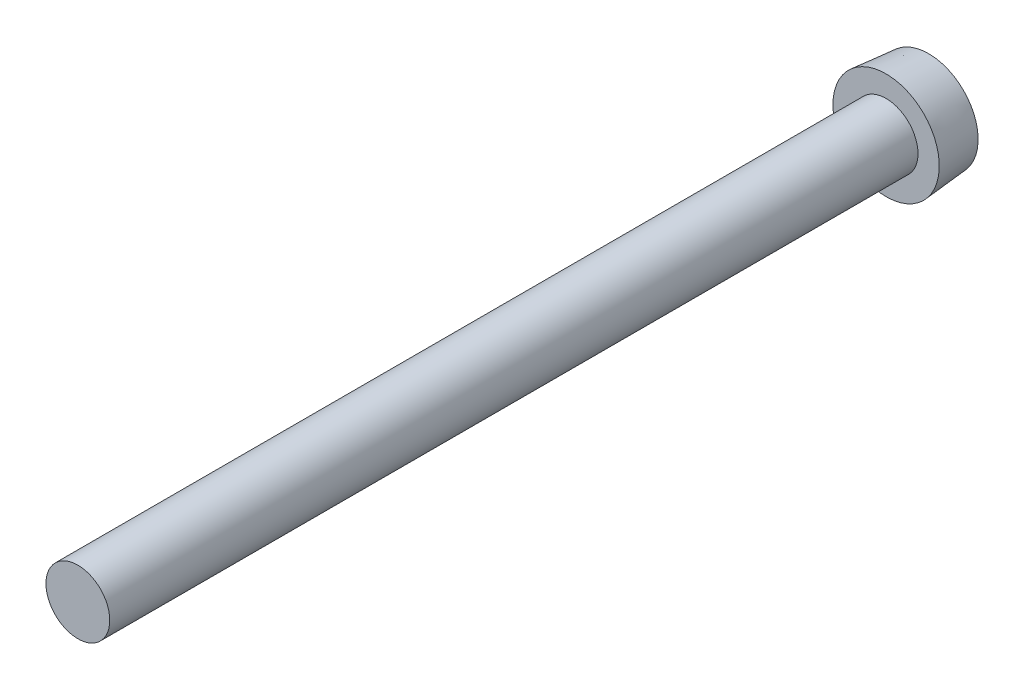
ISO-10303-21;
HEADER;
FILE_DESCRIPTION(('STEP AP214'),'2;1');
FILE_NAME('part.step','',(''),(''),'','','');
FILE_SCHEMA(('AUTOMOTIVE_DESIGN { 1 0 10303 214 1 1 1 1 }'));
ENDSEC;
DATA;
#1=APPLICATION_CONTEXT('core data for automotive mechanical design processes');
#2=APPLICATION_PROTOCOL_DEFINITION('international standard','automotive_design',2000,#1);
#3=PRODUCT_CONTEXT('',#1,'mechanical');
#4=PRODUCT('Part','Part','',(#3));
#5=PRODUCT_RELATED_PRODUCT_CATEGORY('part','',(#4));
#6=PRODUCT_DEFINITION_FORMATION('','',#4);
#7=PRODUCT_DEFINITION_CONTEXT('part definition',#1,'design');
#8=PRODUCT_DEFINITION('design','',#6,#7);
#9=PRODUCT_DEFINITION_SHAPE('','',#8);
#10=(LENGTH_UNIT() NAMED_UNIT(*) SI_UNIT(.MILLI.,.METRE.));
#11=(NAMED_UNIT(*) PLANE_ANGLE_UNIT() SI_UNIT($,.RADIAN.));
#12=(NAMED_UNIT(*) SI_UNIT($,.STERADIAN.) SOLID_ANGLE_UNIT());
#13=UNCERTAINTY_MEASURE_WITH_UNIT(LENGTH_MEASURE(1.E-05),#10,'distance_accuracy_value','');
#14=(GEOMETRIC_REPRESENTATION_CONTEXT(3) GLOBAL_UNCERTAINTY_ASSIGNED_CONTEXT((#13)) GLOBAL_UNIT_ASSIGNED_CONTEXT((#10,
#11,#12)) REPRESENTATION_CONTEXT('',''));
#15=CARTESIAN_POINT('',(0.,0.,0.));
#16=DIRECTION('',(0.,0.,1.));
#17=DIRECTION('',(1.,0.,0.));
#18=AXIS2_PLACEMENT_3D('',#15,#16,#17);
#19=CARTESIAN_POINT('',(0.,0.,38.));
#20=DIRECTION('',(0.,0.,-1.));
#21=DIRECTION('',(-1.,0.,0.));
#22=AXIS2_PLACEMENT_3D('',#19,#20,#21);
#23=CYLINDRICAL_SURFACE('',#22,1.5);
#24=CARTESIAN_POINT('',(0.,0.,38.));
#25=DIRECTION('',(0.,0.,1.));
#26=DIRECTION('',(1.,0.,0.));
#27=AXIS2_PLACEMENT_3D('',#24,#25,#26);
#28=CIRCLE('',#27,1.5);
#29=CARTESIAN_POINT('',(1.5,0.,38.));
#30=VERTEX_POINT('',#29);
#31=EDGE_CURVE('E10',#30,#30,#28,.T.);
#32=ORIENTED_EDGE('',*,*,#31,.F.);
#33=EDGE_LOOP('',(#32));
#34=FACE_BOUND('',#33,.T.);
#35=CARTESIAN_POINT('',(0.,0.,0.));
#36=DIRECTION('',(0.,0.,1.));
#37=DIRECTION('',(1.,0.,0.));
#38=AXIS2_PLACEMENT_3D('',#35,#36,#37);
#39=CIRCLE('',#38,1.5);
#40=CARTESIAN_POINT('',(1.5,0.,0.));
#41=VERTEX_POINT('',#40);
#42=EDGE_CURVE('E34',#41,#41,#39,.T.);
#43=ORIENTED_EDGE('',*,*,#42,.T.);
#44=EDGE_LOOP('',(#43));
#45=FACE_BOUND('',#44,.T.);
#46=ADVANCED_FACE('F31',(#34,#45),#23,.T.);
#47=CARTESIAN_POINT('',(0.,0.,38.));
#48=DIRECTION('',(0.,0.,1.));
#49=DIRECTION('',(1.,0.,0.));
#50=AXIS2_PLACEMENT_3D('',#47,#48,#49);
#51=PLANE('',#50);
#52=ORIENTED_EDGE('',*,*,#31,.T.);
#53=EDGE_LOOP('',(#52));
#54=FACE_BOUND('',#53,.T.);
#55=ADVANCED_FACE('F64',(#54),#51,.T.);
#56=CARTESIAN_POINT('',(0.,0.,0.));
#57=DIRECTION('',(0.,0.,1.));
#58=DIRECTION('',(-1.,0.,0.));
#59=AXIS2_PLACEMENT_3D('',#56,#57,#58);
#60=CONICAL_SURFACE('',#59,2.5,0.0872664625997167);
#61=CARTESIAN_POINT('',(0.,0.,-2.));
#62=DIRECTION('',(0.,0.,-1.));
#63=DIRECTION('',(-1.,0.,0.));
#64=AXIS2_PLACEMENT_3D('',#61,#62,#63);
#65=CIRCLE('',#64,2.32502267294815);
#66=CARTESIAN_POINT('',(-2.32502267294815,0.,-2.));
#67=VERTEX_POINT('',#66);
#68=EDGE_CURVE('E41',#67,#67,#65,.T.);
#69=ORIENTED_EDGE('',*,*,#68,.F.);
#70=EDGE_LOOP('',(#69));
#71=FACE_BOUND('',#70,.T.);
#72=CARTESIAN_POINT('',(0.,0.,0.));
#73=DIRECTION('',(0.,0.,-1.));
#74=DIRECTION('',(-1.,0.,0.));
#75=AXIS2_PLACEMENT_3D('',#72,#73,#74);
#76=CIRCLE('',#75,2.5);
#77=CARTESIAN_POINT('',(-2.5,0.,0.));
#78=VERTEX_POINT('',#77);
#79=EDGE_CURVE('E45',#78,#78,#76,.T.);
#80=ORIENTED_EDGE('',*,*,#79,.T.);
#81=EDGE_LOOP('',(#80));
#82=FACE_BOUND('',#81,.T.);
#83=ADVANCED_FACE('F49',(#71,#82),#60,.T.);
#84=CARTESIAN_POINT('',(0.,0.,-2.));
#85=DIRECTION('',(0.,0.,-1.));
#86=DIRECTION('',(-1.,0.,0.));
#87=AXIS2_PLACEMENT_3D('',#84,#85,#86);
#88=PLANE('',#87);
#89=ORIENTED_EDGE('',*,*,#68,.T.);
#90=EDGE_LOOP('',(#89));
#91=FACE_BOUND('',#90,.T.);
#92=ADVANCED_FACE('F53',(#91),#88,.T.);
#93=CARTESIAN_POINT('',(0.,0.,0.));
#94=DIRECTION('',(0.,0.,-1.));
#95=DIRECTION('',(-1.,0.,0.));
#96=AXIS2_PLACEMENT_3D('',#93,#94,#95);
#97=PLANE('',#96);
#98=ORIENTED_EDGE('',*,*,#42,.F.);
#99=EDGE_LOOP('',(#98));
#100=FACE_BOUND('',#99,.T.);
#101=ORIENTED_EDGE('',*,*,#79,.F.);
#102=EDGE_LOOP('',(#101));
#103=FACE_BOUND('',#102,.T.);
#104=ADVANCED_FACE('F51',(#100,#103),#97,.F.);
#105=CLOSED_SHELL('',(#46,#55,#83,#92,#104));
#106=MANIFOLD_SOLID_BREP('B2',#105);
#107=ADVANCED_BREP_SHAPE_REPRESENTATION('',(#18,#106),#14);
#108=SHAPE_DEFINITION_REPRESENTATION(#9,#107);
ENDSEC;
END-ISO-10303-21;
